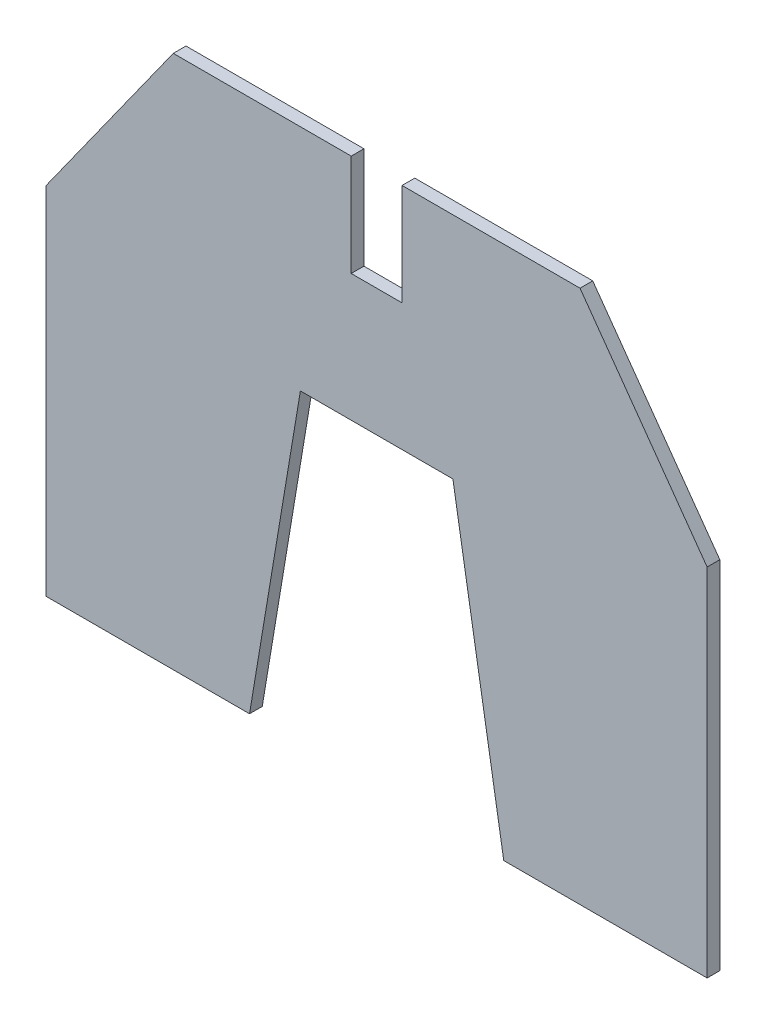
ISO-10303-21;
HEADER;
FILE_DESCRIPTION(('STEP AP214'),'2;1');
FILE_NAME('part.step','',(''),(''),'','','');
FILE_SCHEMA(('AUTOMOTIVE_DESIGN { 1 0 10303 214 1 1 1 1 }'));
ENDSEC;
DATA;
#1=APPLICATION_CONTEXT('core data for automotive mechanical design processes');
#2=APPLICATION_PROTOCOL_DEFINITION('international standard','automotive_design',2000,#1);
#3=PRODUCT_CONTEXT('',#1,'mechanical');
#4=PRODUCT('Part','Part','',(#3));
#5=PRODUCT_RELATED_PRODUCT_CATEGORY('part','',(#4));
#6=PRODUCT_DEFINITION_FORMATION('','',#4);
#7=PRODUCT_DEFINITION_CONTEXT('part definition',#1,'design');
#8=PRODUCT_DEFINITION('design','',#6,#7);
#9=PRODUCT_DEFINITION_SHAPE('','',#8);
#10=(LENGTH_UNIT() NAMED_UNIT(*) SI_UNIT(.MILLI.,.METRE.));
#11=(NAMED_UNIT(*) PLANE_ANGLE_UNIT() SI_UNIT($,.RADIAN.));
#12=(NAMED_UNIT(*) SI_UNIT($,.STERADIAN.) SOLID_ANGLE_UNIT());
#13=UNCERTAINTY_MEASURE_WITH_UNIT(LENGTH_MEASURE(1.E-05),#10,'distance_accuracy_value','');
#14=(GEOMETRIC_REPRESENTATION_CONTEXT(3) GLOBAL_UNCERTAINTY_ASSIGNED_CONTEXT((#13)) GLOBAL_UNIT_ASSIGNED_CONTEXT((#10,
#11,#12)) REPRESENTATION_CONTEXT('',''));
#15=CARTESIAN_POINT('',(0.,0.,0.));
#16=DIRECTION('',(0.,0.,1.));
#17=DIRECTION('',(1.,0.,0.));
#18=AXIS2_PLACEMENT_3D('',#15,#16,#17);
#19=CARTESIAN_POINT('',(15.,60.,2.5));
#20=DIRECTION('',(0.986393923832144,0.164398987305357,0.));
#21=DIRECTION('',(-0.164398987305357,0.986393923832144,0.));
#22=AXIS2_PLACEMENT_3D('',#19,#20,#21);
#23=PLANE('',#22);
#24=DIRECTION('',(0.164398987305357,-0.986393923832144,0.));
#25=VECTOR('',#24,1.);
#26=CARTESIAN_POINT('',(15.,60.,0.));
#27=LINE('',#26,#25);
#28=CARTESIAN_POINT('',(15.,60.,0.));
#29=VERTEX_POINT('',#28);
#30=CARTESIAN_POINT('',(25.,0.,0.));
#31=VERTEX_POINT('',#30);
#32=EDGE_CURVE('E176',#29,#31,#27,.T.);
#33=ORIENTED_EDGE('',*,*,#32,.T.);
#34=DIRECTION('',(0.,0.,-1.));
#35=VECTOR('',#34,1.);
#36=CARTESIAN_POINT('',(25.,0.,2.5));
#37=LINE('',#36,#35);
#38=CARTESIAN_POINT('',(25.,0.,2.5));
#39=VERTEX_POINT('',#38);
#40=EDGE_CURVE('E11',#39,#31,#37,.T.);
#41=ORIENTED_EDGE('',*,*,#40,.F.);
#42=DIRECTION('',(0.164398987305357,-0.986393923832144,0.));
#43=VECTOR('',#42,1.);
#44=CARTESIAN_POINT('',(15.,60.,2.5));
#45=LINE('',#44,#43);
#46=CARTESIAN_POINT('',(15.,60.,2.5));
#47=VERTEX_POINT('',#46);
#48=EDGE_CURVE('E216',#47,#39,#45,.T.);
#49=ORIENTED_EDGE('',*,*,#48,.F.);
#50=DIRECTION('',(0.,0.,-1.));
#51=VECTOR('',#50,1.);
#52=CARTESIAN_POINT('',(15.,60.,2.5));
#53=LINE('',#52,#51);
#54=EDGE_CURVE('E172',#47,#29,#53,.T.);
#55=ORIENTED_EDGE('',*,*,#54,.T.);
#56=EDGE_LOOP('',(#33,#41,#49,#55));
#57=FACE_BOUND('',#56,.T.);
#58=ADVANCED_FACE('F39',(#57),#23,.F.);
#59=CARTESIAN_POINT('',(25.,0.,2.5));
#60=DIRECTION('',(0.,1.,0.));
#61=DIRECTION('',(-1.,0.,0.));
#62=AXIS2_PLACEMENT_3D('',#59,#60,#61);
#63=PLANE('',#62);
#64=DIRECTION('',(1.,0.,0.));
#65=VECTOR('',#64,1.);
#66=CARTESIAN_POINT('',(25.,0.,0.));
#67=LINE('',#66,#65);
#68=CARTESIAN_POINT('',(65.,0.,0.));
#69=VERTEX_POINT('',#68);
#70=EDGE_CURVE('E180',#31,#69,#67,.T.);
#71=ORIENTED_EDGE('',*,*,#70,.T.);
#72=DIRECTION('',(0.,0.,-1.));
#73=VECTOR('',#72,1.);
#74=CARTESIAN_POINT('',(65.,0.,2.5));
#75=LINE('',#74,#73);
#76=CARTESIAN_POINT('',(65.,0.,2.5));
#77=VERTEX_POINT('',#76);
#78=EDGE_CURVE('E48',#77,#69,#75,.T.);
#79=ORIENTED_EDGE('',*,*,#78,.F.);
#80=DIRECTION('',(1.,0.,0.));
#81=VECTOR('',#80,1.);
#82=CARTESIAN_POINT('',(25.,0.,2.5));
#83=LINE('',#82,#81);
#84=EDGE_CURVE('E117',#39,#77,#83,.T.);
#85=ORIENTED_EDGE('',*,*,#84,.F.);
#86=ORIENTED_EDGE('',*,*,#40,.T.);
#87=EDGE_LOOP('',(#71,#79,#85,#86));
#88=FACE_BOUND('',#87,.T.);
#89=ADVANCED_FACE('F324',(#88),#63,.F.);
#90=CARTESIAN_POINT('',(65.,0.,2.5));
#91=DIRECTION('',(-1.,0.,0.));
#92=DIRECTION('',(0.,0.,1.));
#93=AXIS2_PLACEMENT_3D('',#90,#91,#92);
#94=PLANE('',#93);
#95=DIRECTION('',(0.,1.,0.));
#96=VECTOR('',#95,1.);
#97=CARTESIAN_POINT('',(65.,0.,0.));
#98=LINE('',#97,#96);
#99=CARTESIAN_POINT('',(65.,70.,0.));
#100=VERTEX_POINT('',#99);
#101=EDGE_CURVE('E183',#69,#100,#98,.T.);
#102=ORIENTED_EDGE('',*,*,#101,.T.);
#103=DIRECTION('',(0.,0.,-1.));
#104=VECTOR('',#103,1.);
#105=CARTESIAN_POINT('',(65.,70.,2.5));
#106=LINE('',#105,#104);
#107=CARTESIAN_POINT('',(65.,70.,2.5));
#108=VERTEX_POINT('',#107);
#109=EDGE_CURVE('E251',#108,#100,#106,.T.);
#110=ORIENTED_EDGE('',*,*,#109,.F.);
#111=DIRECTION('',(0.,1.,0.));
#112=VECTOR('',#111,1.);
#113=CARTESIAN_POINT('',(65.,0.,2.5));
#114=LINE('',#113,#112);
#115=EDGE_CURVE('E261',#77,#108,#114,.T.);
#116=ORIENTED_EDGE('',*,*,#115,.F.);
#117=ORIENTED_EDGE('',*,*,#78,.T.);
#118=EDGE_LOOP('',(#102,#110,#116,#117));
#119=FACE_BOUND('',#118,.T.);
#120=ADVANCED_FACE('F259',(#119),#94,.F.);
#121=CARTESIAN_POINT('',(65.,70.,2.5));
#122=DIRECTION('',(-0.813733471206735,-0.581238193719097,0.));
#123=DIRECTION('',(0.581238193719097,-0.813733471206735,0.));
#124=AXIS2_PLACEMENT_3D('',#121,#122,#123);
#125=PLANE('',#124);
#126=DIRECTION('',(-0.581238193719097,0.813733471206735,0.));
#127=VECTOR('',#126,1.);
#128=CARTESIAN_POINT('',(65.,70.,0.));
#129=LINE('',#128,#127);
#130=CARTESIAN_POINT('',(40.,105.,0.));
#131=VERTEX_POINT('',#130);
#132=EDGE_CURVE('E186',#100,#131,#129,.T.);
#133=ORIENTED_EDGE('',*,*,#132,.T.);
#134=DIRECTION('',(0.,0.,-1.));
#135=VECTOR('',#134,1.);
#136=CARTESIAN_POINT('',(40.,105.,2.5));
#137=LINE('',#136,#135);
#138=CARTESIAN_POINT('',(40.,105.,2.5));
#139=VERTEX_POINT('',#138);
#140=EDGE_CURVE('E247',#139,#131,#137,.T.);
#141=ORIENTED_EDGE('',*,*,#140,.F.);
#142=DIRECTION('',(-0.581238193719097,0.813733471206735,0.));
#143=VECTOR('',#142,1.);
#144=CARTESIAN_POINT('',(65.,70.,2.5));
#145=LINE('',#144,#143);
#146=EDGE_CURVE('E280',#108,#139,#145,.T.);
#147=ORIENTED_EDGE('',*,*,#146,.F.);
#148=ORIENTED_EDGE('',*,*,#109,.T.);
#149=EDGE_LOOP('',(#133,#141,#147,#148));
#150=FACE_BOUND('',#149,.T.);
#151=ADVANCED_FACE('F270',(#150),#125,.F.);
#152=CARTESIAN_POINT('',(40.,105.,2.5));
#153=DIRECTION('',(0.,-1.,0.));
#154=DIRECTION('',(0.,0.,-1.));
#155=AXIS2_PLACEMENT_3D('',#152,#153,#154);
#156=PLANE('',#155);
#157=DIRECTION('',(-1.,0.,0.));
#158=VECTOR('',#157,1.);
#159=CARTESIAN_POINT('',(40.,105.,0.));
#160=LINE('',#159,#158);
#161=CARTESIAN_POINT('',(5.,105.,0.));
#162=VERTEX_POINT('',#161);
#163=EDGE_CURVE('E189',#131,#162,#160,.T.);
#164=ORIENTED_EDGE('',*,*,#163,.T.);
#165=DIRECTION('',(0.,0.,-1.));
#166=VECTOR('',#165,1.);
#167=CARTESIAN_POINT('',(5.,105.,2.5));
#168=LINE('',#167,#166);
#169=CARTESIAN_POINT('',(5.,105.,2.5));
#170=VERTEX_POINT('',#169);
#171=EDGE_CURVE('E243',#170,#162,#168,.T.);
#172=ORIENTED_EDGE('',*,*,#171,.F.);
#173=DIRECTION('',(-1.,0.,0.));
#174=VECTOR('',#173,1.);
#175=CARTESIAN_POINT('',(40.,105.,2.5));
#176=LINE('',#175,#174);
#177=EDGE_CURVE('E276',#139,#170,#176,.T.);
#178=ORIENTED_EDGE('',*,*,#177,.F.);
#179=ORIENTED_EDGE('',*,*,#140,.T.);
#180=EDGE_LOOP('',(#164,#172,#178,#179));
#181=FACE_BOUND('',#180,.T.);
#182=ADVANCED_FACE('F274',(#181),#156,.F.);
#183=CARTESIAN_POINT('',(5.,105.,2.5));
#184=DIRECTION('',(1.,0.,0.));
#185=DIRECTION('',(0.,1.,0.));
#186=AXIS2_PLACEMENT_3D('',#183,#184,#185);
#187=PLANE('',#186);
#188=DIRECTION('',(0.,-1.,0.));
#189=VECTOR('',#188,1.);
#190=CARTESIAN_POINT('',(5.,105.,0.));
#191=LINE('',#190,#189);
#192=CARTESIAN_POINT('',(5.,85.,0.));
#193=VERTEX_POINT('',#192);
#194=EDGE_CURVE('E192',#162,#193,#191,.T.);
#195=ORIENTED_EDGE('',*,*,#194,.T.);
#196=DIRECTION('',(0.,0.,-1.));
#197=VECTOR('',#196,1.);
#198=CARTESIAN_POINT('',(5.,85.,2.5));
#199=LINE('',#198,#197);
#200=CARTESIAN_POINT('',(5.,85.,2.5));
#201=VERTEX_POINT('',#200);
#202=EDGE_CURVE('E239',#201,#193,#199,.T.);
#203=ORIENTED_EDGE('',*,*,#202,.F.);
#204=DIRECTION('',(0.,-1.,0.));
#205=VECTOR('',#204,1.);
#206=CARTESIAN_POINT('',(5.,105.,2.5));
#207=LINE('',#206,#205);
#208=EDGE_CURVE('E279',#170,#201,#207,.T.);
#209=ORIENTED_EDGE('',*,*,#208,.F.);
#210=ORIENTED_EDGE('',*,*,#171,.T.);
#211=EDGE_LOOP('',(#195,#203,#209,#210));
#212=FACE_BOUND('',#211,.T.);
#213=ADVANCED_FACE('F337',(#212),#187,.F.);
#214=CARTESIAN_POINT('',(5.,85.,2.5));
#215=DIRECTION('',(0.,-1.,0.));
#216=DIRECTION('',(0.,0.,-1.));
#217=AXIS2_PLACEMENT_3D('',#214,#215,#216);
#218=PLANE('',#217);
#219=DIRECTION('',(-1.,0.,0.));
#220=VECTOR('',#219,1.);
#221=CARTESIAN_POINT('',(5.,85.,0.));
#222=LINE('',#221,#220);
#223=CARTESIAN_POINT('',(-5.,85.,0.));
#224=VERTEX_POINT('',#223);
#225=EDGE_CURVE('E195',#193,#224,#222,.T.);
#226=ORIENTED_EDGE('',*,*,#225,.T.);
#227=DIRECTION('',(0.,0.,-1.));
#228=VECTOR('',#227,1.);
#229=CARTESIAN_POINT('',(-5.,85.,2.5));
#230=LINE('',#229,#228);
#231=CARTESIAN_POINT('',(-5.,85.,2.5));
#232=VERTEX_POINT('',#231);
#233=EDGE_CURVE('E235',#232,#224,#230,.T.);
#234=ORIENTED_EDGE('',*,*,#233,.F.);
#235=DIRECTION('',(-1.,0.,0.));
#236=VECTOR('',#235,1.);
#237=CARTESIAN_POINT('',(5.,85.,2.5));
#238=LINE('',#237,#236);
#239=EDGE_CURVE('E284',#201,#232,#238,.T.);
#240=ORIENTED_EDGE('',*,*,#239,.F.);
#241=ORIENTED_EDGE('',*,*,#202,.T.);
#242=EDGE_LOOP('',(#226,#234,#240,#241));
#243=FACE_BOUND('',#242,.T.);
#244=ADVANCED_FACE('F340',(#243),#218,.F.);
#245=CARTESIAN_POINT('',(-5.,105.,2.5));
#246=DIRECTION('',(-1.,0.,0.));
#247=DIRECTION('',(0.,-1.,0.));
#248=AXIS2_PLACEMENT_3D('',#245,#246,#247);
#249=PLANE('',#248);
#250=DIRECTION('',(0.,1.,0.));
#251=VECTOR('',#250,1.);
#252=CARTESIAN_POINT('',(-5.,105.,0.));
#253=LINE('',#252,#251);
#254=CARTESIAN_POINT('',(-5.,105.,0.));
#255=VERTEX_POINT('',#254);
#256=EDGE_CURVE('E198',#224,#255,#253,.T.);
#257=ORIENTED_EDGE('',*,*,#256,.T.);
#258=DIRECTION('',(0.,0.,-1.));
#259=VECTOR('',#258,1.);
#260=CARTESIAN_POINT('',(-5.,105.,2.5));
#261=LINE('',#260,#259);
#262=CARTESIAN_POINT('',(-5.,105.,2.5));
#263=VERTEX_POINT('',#262);
#264=EDGE_CURVE('E231',#263,#255,#261,.T.);
#265=ORIENTED_EDGE('',*,*,#264,.F.);
#266=DIRECTION('',(0.,1.,0.));
#267=VECTOR('',#266,1.);
#268=CARTESIAN_POINT('',(-5.,105.,2.5));
#269=LINE('',#268,#267);
#270=EDGE_CURVE('E291',#232,#263,#269,.T.);
#271=ORIENTED_EDGE('',*,*,#270,.F.);
#272=ORIENTED_EDGE('',*,*,#233,.T.);
#273=EDGE_LOOP('',(#257,#265,#271,#272));
#274=FACE_BOUND('',#273,.T.);
#275=ADVANCED_FACE('F344',(#274),#249,.F.);
#276=CARTESIAN_POINT('',(-40.,105.,2.5));
#277=DIRECTION('',(0.,-1.,0.));
#278=DIRECTION('',(0.,0.,-1.));
#279=AXIS2_PLACEMENT_3D('',#276,#277,#278);
#280=PLANE('',#279);
#281=DIRECTION('',(-1.,0.,0.));
#282=VECTOR('',#281,1.);
#283=CARTESIAN_POINT('',(-40.,105.,0.));
#284=LINE('',#283,#282);
#285=CARTESIAN_POINT('',(-40.,105.,0.));
#286=VERTEX_POINT('',#285);
#287=EDGE_CURVE('E201',#255,#286,#284,.T.);
#288=ORIENTED_EDGE('',*,*,#287,.T.);
#289=DIRECTION('',(0.,0.,-1.));
#290=VECTOR('',#289,1.);
#291=CARTESIAN_POINT('',(-40.,105.,2.5));
#292=LINE('',#291,#290);
#293=CARTESIAN_POINT('',(-40.,105.,2.5));
#294=VERTEX_POINT('',#293);
#295=EDGE_CURVE('E227',#294,#286,#292,.T.);
#296=ORIENTED_EDGE('',*,*,#295,.F.);
#297=DIRECTION('',(-1.,0.,0.));
#298=VECTOR('',#297,1.);
#299=CARTESIAN_POINT('',(-40.,105.,2.5));
#300=LINE('',#299,#298);
#301=EDGE_CURVE('E294',#263,#294,#300,.T.);
#302=ORIENTED_EDGE('',*,*,#301,.F.);
#303=ORIENTED_EDGE('',*,*,#264,.T.);
#304=EDGE_LOOP('',(#288,#296,#302,#303));
#305=FACE_BOUND('',#304,.T.);
#306=ADVANCED_FACE('F348',(#305),#280,.F.);
#307=CARTESIAN_POINT('',(-65.,70.,2.5));
#308=DIRECTION('',(0.813733471206735,-0.581238193719097,0.));
#309=DIRECTION('',(0.581238193719097,0.813733471206735,0.));
#310=AXIS2_PLACEMENT_3D('',#307,#308,#309);
#311=PLANE('',#310);
#312=DIRECTION('',(-0.581238193719097,-0.813733471206735,0.));
#313=VECTOR('',#312,1.);
#314=CARTESIAN_POINT('',(-65.,70.,0.));
#315=LINE('',#314,#313);
#316=CARTESIAN_POINT('',(-65.,70.,0.));
#317=VERTEX_POINT('',#316);
#318=EDGE_CURVE('E204',#286,#317,#315,.T.);
#319=ORIENTED_EDGE('',*,*,#318,.T.);
#320=DIRECTION('',(0.,0.,-1.));
#321=VECTOR('',#320,1.);
#322=CARTESIAN_POINT('',(-65.,70.,2.5));
#323=LINE('',#322,#321);
#324=CARTESIAN_POINT('',(-65.,70.,2.5));
#325=VERTEX_POINT('',#324);
#326=EDGE_CURVE('E223',#325,#317,#323,.T.);
#327=ORIENTED_EDGE('',*,*,#326,.F.);
#328=DIRECTION('',(-0.581238193719097,-0.813733471206735,0.));
#329=VECTOR('',#328,1.);
#330=CARTESIAN_POINT('',(-65.,70.,2.5));
#331=LINE('',#330,#329);
#332=EDGE_CURVE('E297',#294,#325,#331,.T.);
#333=ORIENTED_EDGE('',*,*,#332,.F.);
#334=ORIENTED_EDGE('',*,*,#295,.T.);
#335=EDGE_LOOP('',(#319,#327,#333,#334));
#336=FACE_BOUND('',#335,.T.);
#337=ADVANCED_FACE('F305',(#336),#311,.F.);
#338=CARTESIAN_POINT('',(-65.,0.,2.5));
#339=DIRECTION('',(1.,0.,0.));
#340=DIRECTION('',(0.,0.,-1.));
#341=AXIS2_PLACEMENT_3D('',#338,#339,#340);
#342=PLANE('',#341);
#343=DIRECTION('',(0.,-1.,0.));
#344=VECTOR('',#343,1.);
#345=CARTESIAN_POINT('',(-65.,0.,0.));
#346=LINE('',#345,#344);
#347=CARTESIAN_POINT('',(-65.,0.,0.));
#348=VERTEX_POINT('',#347);
#349=EDGE_CURVE('E207',#317,#348,#346,.T.);
#350=ORIENTED_EDGE('',*,*,#349,.T.);
#351=DIRECTION('',(0.,0.,-1.));
#352=VECTOR('',#351,1.);
#353=CARTESIAN_POINT('',(-65.,0.,2.5));
#354=LINE('',#353,#352);
#355=CARTESIAN_POINT('',(-65.,0.,2.5));
#356=VERTEX_POINT('',#355);
#357=EDGE_CURVE('E165',#356,#348,#354,.T.);
#358=ORIENTED_EDGE('',*,*,#357,.F.);
#359=DIRECTION('',(0.,-1.,0.));
#360=VECTOR('',#359,1.);
#361=CARTESIAN_POINT('',(-65.,0.,2.5));
#362=LINE('',#361,#360);
#363=EDGE_CURVE('E154',#325,#356,#362,.T.);
#364=ORIENTED_EDGE('',*,*,#363,.F.);
#365=ORIENTED_EDGE('',*,*,#326,.T.);
#366=EDGE_LOOP('',(#350,#358,#364,#365));
#367=FACE_BOUND('',#366,.T.);
#368=ADVANCED_FACE('F309',(#367),#342,.F.);
#369=CARTESIAN_POINT('',(-25.,0.,2.5));
#370=DIRECTION('',(0.,1.,0.));
#371=DIRECTION('',(-1.,0.,0.));
#372=AXIS2_PLACEMENT_3D('',#369,#370,#371);
#373=PLANE('',#372);
#374=DIRECTION('',(1.,0.,0.));
#375=VECTOR('',#374,1.);
#376=CARTESIAN_POINT('',(-25.,0.,0.));
#377=LINE('',#376,#375);
#378=CARTESIAN_POINT('',(-25.,0.,0.));
#379=VERTEX_POINT('',#378);
#380=EDGE_CURVE('E163',#348,#379,#377,.T.);
#381=ORIENTED_EDGE('',*,*,#380,.T.);
#382=DIRECTION('',(0.,0.,-1.));
#383=VECTOR('',#382,1.);
#384=CARTESIAN_POINT('',(-25.,0.,2.5));
#385=LINE('',#384,#383);
#386=CARTESIAN_POINT('',(-25.,0.,2.5));
#387=VERTEX_POINT('',#386);
#388=EDGE_CURVE('E160',#387,#379,#385,.T.);
#389=ORIENTED_EDGE('',*,*,#388,.F.);
#390=DIRECTION('',(1.,0.,0.));
#391=VECTOR('',#390,1.);
#392=CARTESIAN_POINT('',(-25.,0.,2.5));
#393=LINE('',#392,#391);
#394=EDGE_CURVE('E148',#356,#387,#393,.T.);
#395=ORIENTED_EDGE('',*,*,#394,.F.);
#396=ORIENTED_EDGE('',*,*,#357,.T.);
#397=EDGE_LOOP('',(#381,#389,#395,#396));
#398=FACE_BOUND('',#397,.T.);
#399=ADVANCED_FACE('F161',(#398),#373,.F.);
#400=CARTESIAN_POINT('',(-15.,60.,2.5));
#401=DIRECTION('',(-0.986393923832144,0.164398987305357,0.));
#402=DIRECTION('',(-0.164398987305357,-0.986393923832144,0.));
#403=AXIS2_PLACEMENT_3D('',#400,#401,#402);
#404=PLANE('',#403);
#405=DIRECTION('',(0.164398987305357,0.986393923832144,0.));
#406=VECTOR('',#405,1.);
#407=CARTESIAN_POINT('',(-15.,60.,0.));
#408=LINE('',#407,#406);
#409=CARTESIAN_POINT('',(-15.,60.,0.));
#410=VERTEX_POINT('',#409);
#411=EDGE_CURVE('E103',#379,#410,#408,.T.);
#412=ORIENTED_EDGE('',*,*,#411,.T.);
#413=DIRECTION('',(0.,0.,-1.));
#414=VECTOR('',#413,1.);
#415=CARTESIAN_POINT('',(-15.,60.,2.5));
#416=LINE('',#415,#414);
#417=CARTESIAN_POINT('',(-15.,60.,2.5));
#418=VERTEX_POINT('',#417);
#419=EDGE_CURVE('E166',#418,#410,#416,.T.);
#420=ORIENTED_EDGE('',*,*,#419,.F.);
#421=DIRECTION('',(0.164398987305357,0.986393923832144,0.));
#422=VECTOR('',#421,1.);
#423=CARTESIAN_POINT('',(-15.,60.,2.5));
#424=LINE('',#423,#422);
#425=EDGE_CURVE('E152',#387,#418,#424,.T.);
#426=ORIENTED_EDGE('',*,*,#425,.F.);
#427=ORIENTED_EDGE('',*,*,#388,.T.);
#428=EDGE_LOOP('',(#412,#420,#426,#427));
#429=FACE_BOUND('',#428,.T.);
#430=ADVANCED_FACE('F168',(#429),#404,.F.);
#431=CARTESIAN_POINT('',(-15.,60.,2.5));
#432=DIRECTION('',(0.,1.,0.));
#433=DIRECTION('',(0.,0.,1.));
#434=AXIS2_PLACEMENT_3D('',#431,#432,#433);
#435=PLANE('',#434);
#436=DIRECTION('',(1.,0.,0.));
#437=VECTOR('',#436,1.);
#438=CARTESIAN_POINT('',(-15.,60.,0.));
#439=LINE('',#438,#437);
#440=EDGE_CURVE('E109',#410,#29,#439,.T.);
#441=ORIENTED_EDGE('',*,*,#440,.T.);
#442=ORIENTED_EDGE('',*,*,#54,.F.);
#443=DIRECTION('',(1.,0.,0.));
#444=VECTOR('',#443,1.);
#445=CARTESIAN_POINT('',(-15.,60.,2.5));
#446=LINE('',#445,#444);
#447=EDGE_CURVE('E56',#418,#47,#446,.T.);
#448=ORIENTED_EDGE('',*,*,#447,.F.);
#449=ORIENTED_EDGE('',*,*,#419,.T.);
#450=EDGE_LOOP('',(#441,#442,#448,#449));
#451=FACE_BOUND('',#450,.T.);
#452=ADVANCED_FACE('F313',(#451),#435,.F.);
#453=CARTESIAN_POINT('',(0.,0.,2.5));
#454=DIRECTION('',(0.,0.,1.));
#455=DIRECTION('',(1.,0.,0.));
#456=AXIS2_PLACEMENT_3D('',#453,#454,#455);
#457=PLANE('',#456);
#458=ORIENTED_EDGE('',*,*,#48,.T.);
#459=ORIENTED_EDGE('',*,*,#84,.T.);
#460=ORIENTED_EDGE('',*,*,#115,.T.);
#461=ORIENTED_EDGE('',*,*,#146,.T.);
#462=ORIENTED_EDGE('',*,*,#177,.T.);
#463=ORIENTED_EDGE('',*,*,#208,.T.);
#464=ORIENTED_EDGE('',*,*,#239,.T.);
#465=ORIENTED_EDGE('',*,*,#270,.T.);
#466=ORIENTED_EDGE('',*,*,#301,.T.);
#467=ORIENTED_EDGE('',*,*,#332,.T.);
#468=ORIENTED_EDGE('',*,*,#363,.T.);
#469=ORIENTED_EDGE('',*,*,#394,.T.);
#470=ORIENTED_EDGE('',*,*,#425,.T.);
#471=ORIENTED_EDGE('',*,*,#447,.T.);
#472=EDGE_LOOP('',(#458,#459,#460,#461,#462,#463,#464,#465,#466,#467,#468,#469,#470,#471));
#473=FACE_BOUND('',#472,.T.);
#474=ADVANCED_FACE('F150',(#473),#457,.T.);
#475=CARTESIAN_POINT('',(0.,0.,0.));
#476=DIRECTION('',(0.,0.,1.));
#477=DIRECTION('',(1.,0.,0.));
#478=AXIS2_PLACEMENT_3D('',#475,#476,#477);
#479=PLANE('',#478);
#480=ORIENTED_EDGE('',*,*,#32,.F.);
#481=ORIENTED_EDGE('',*,*,#440,.F.);
#482=ORIENTED_EDGE('',*,*,#411,.F.);
#483=ORIENTED_EDGE('',*,*,#380,.F.);
#484=ORIENTED_EDGE('',*,*,#349,.F.);
#485=ORIENTED_EDGE('',*,*,#318,.F.);
#486=ORIENTED_EDGE('',*,*,#287,.F.);
#487=ORIENTED_EDGE('',*,*,#256,.F.);
#488=ORIENTED_EDGE('',*,*,#225,.F.);
#489=ORIENTED_EDGE('',*,*,#194,.F.);
#490=ORIENTED_EDGE('',*,*,#163,.F.);
#491=ORIENTED_EDGE('',*,*,#132,.F.);
#492=ORIENTED_EDGE('',*,*,#101,.F.);
#493=ORIENTED_EDGE('',*,*,#70,.F.);
#494=EDGE_LOOP('',(#480,#481,#482,#483,#484,#485,#486,#487,#488,#489,#490,#491,#492,#493));
#495=FACE_BOUND('',#494,.T.);
#496=ADVANCED_FACE('F265',(#495),#479,.F.);
#497=CLOSED_SHELL('',(#58,#89,#120,#151,#182,#213,#244,#275,#306,#337,#368,#399,#430,#452,#474,#496));
#498=MANIFOLD_SOLID_BREP('B2',#497);
#499=ADVANCED_BREP_SHAPE_REPRESENTATION('',(#18,#498),#14);
#500=SHAPE_DEFINITION_REPRESENTATION(#9,#499);
ENDSEC;
END-ISO-10303-21;
